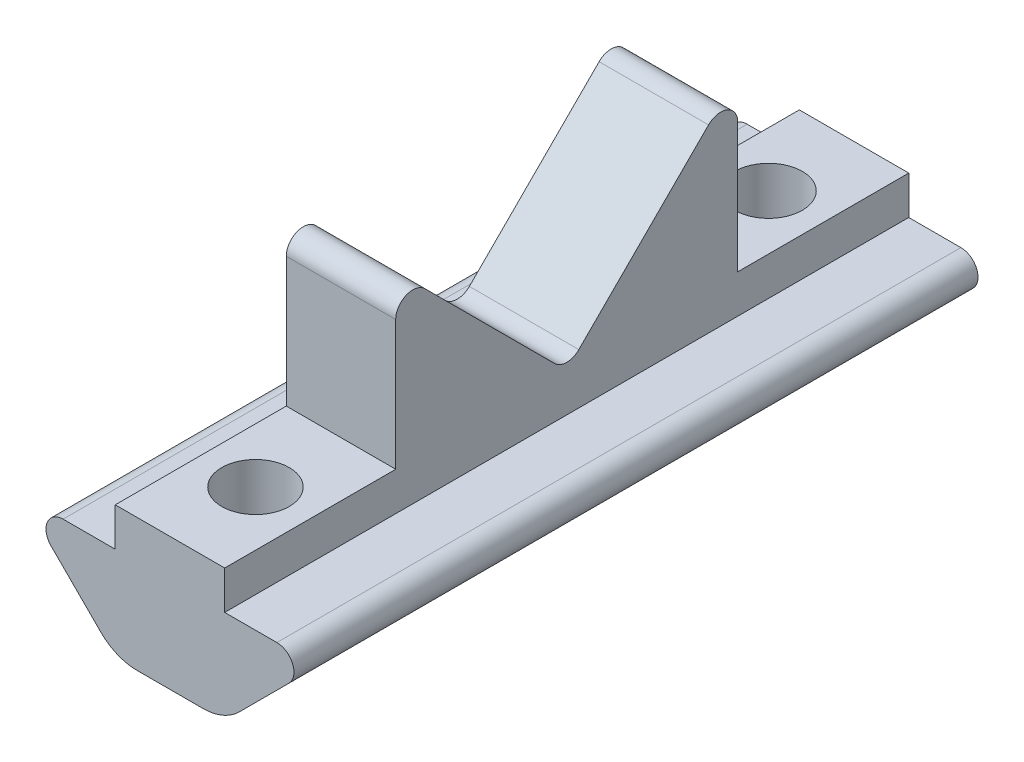
ISO-10303-21;
HEADER;
FILE_DESCRIPTION(('STEP AP214'),'2;1');
FILE_NAME('part.step','',(''),(''),'','','');
FILE_SCHEMA(('AUTOMOTIVE_DESIGN { 1 0 10303 214 1 1 1 1 }'));
ENDSEC;
DATA;
#1=APPLICATION_CONTEXT('core data for automotive mechanical design processes');
#2=APPLICATION_PROTOCOL_DEFINITION('international standard','automotive_design',2000,#1);
#3=PRODUCT_CONTEXT('',#1,'mechanical');
#4=PRODUCT('Part','Part','',(#3));
#5=PRODUCT_RELATED_PRODUCT_CATEGORY('part','',(#4));
#6=PRODUCT_DEFINITION_FORMATION('','',#4);
#7=PRODUCT_DEFINITION_CONTEXT('part definition',#1,'design');
#8=PRODUCT_DEFINITION('design','',#6,#7);
#9=PRODUCT_DEFINITION_SHAPE('','',#8);
#10=(LENGTH_UNIT() NAMED_UNIT(*) SI_UNIT(.MILLI.,.METRE.));
#11=(NAMED_UNIT(*) PLANE_ANGLE_UNIT() SI_UNIT($,.RADIAN.));
#12=(NAMED_UNIT(*) SI_UNIT($,.STERADIAN.) SOLID_ANGLE_UNIT());
#13=UNCERTAINTY_MEASURE_WITH_UNIT(LENGTH_MEASURE(1.E-05),#10,'distance_accuracy_value','');
#14=(GEOMETRIC_REPRESENTATION_CONTEXT(3) GLOBAL_UNCERTAINTY_ASSIGNED_CONTEXT((#13)) GLOBAL_UNIT_ASSIGNED_CONTEXT((#10,
#11,#12)) REPRESENTATION_CONTEXT('',''));
#15=CARTESIAN_POINT('',(0.,0.,0.));
#16=DIRECTION('',(0.,0.,1.));
#17=DIRECTION('',(1.,0.,0.));
#18=AXIS2_PLACEMENT_3D('',#15,#16,#17);
#19=CARTESIAN_POINT('',(3.20000000000003,7.75,20.));
#20=DIRECTION('',(0.,-1.,0.));
#21=DIRECTION('',(0.,0.,-1.));
#22=AXIS2_PLACEMENT_3D('',#19,#20,#21);
#23=PLANE('',#22);
#24=CARTESIAN_POINT('',(0.,7.75,-15.));
#25=DIRECTION('',(0.,1.,0.));
#26=DIRECTION('',(0.,0.,1.));
#27=AXIS2_PLACEMENT_3D('',#24,#25,#26);
#28=CIRCLE('',#27,1.975);
#29=CARTESIAN_POINT('',(0.,7.75,-13.025));
#30=VERTEX_POINT('',#29);
#31=EDGE_CURVE('E334',#30,#30,#28,.T.);
#32=ORIENTED_EDGE('',*,*,#31,.F.);
#33=EDGE_LOOP('',(#32));
#34=FACE_BOUND('',#33,.T.);
#35=DIRECTION('',(-1.,0.,0.));
#36=VECTOR('',#35,1.);
#37=CARTESIAN_POINT('',(17.342135623731,7.75,-9.99999999999999));
#38=LINE('',#37,#36);
#39=CARTESIAN_POINT('',(3.20000000000003,7.75,-9.99999999999999));
#40=VERTEX_POINT('',#39);
#41=CARTESIAN_POINT('',(-3.19999999999997,7.75,-9.99999999999999));
#42=VERTEX_POINT('',#41);
#43=EDGE_CURVE('E205',#40,#42,#38,.T.);
#44=ORIENTED_EDGE('',*,*,#43,.F.);
#45=DIRECTION('',(0.,0.,-1.));
#46=VECTOR('',#45,1.);
#47=CARTESIAN_POINT('',(3.20000000000003,7.75,20.));
#48=LINE('',#47,#46);
#49=CARTESIAN_POINT('',(3.20000000000003,7.75,-20.));
#50=VERTEX_POINT('',#49);
#51=EDGE_CURVE('E214',#40,#50,#48,.T.);
#52=ORIENTED_EDGE('',*,*,#51,.T.);
#53=DIRECTION('',(-1.,0.,0.));
#54=VECTOR('',#53,1.);
#55=CARTESIAN_POINT('',(3.20000000000003,7.75,-20.));
#56=LINE('',#55,#54);
#57=CARTESIAN_POINT('',(-3.19999999999997,7.75,-20.));
#58=VERTEX_POINT('',#57);
#59=EDGE_CURVE('E397',#50,#58,#56,.T.);
#60=ORIENTED_EDGE('',*,*,#59,.T.);
#61=DIRECTION('',(0.,0.,-1.));
#62=VECTOR('',#61,1.);
#63=CARTESIAN_POINT('',(-3.19999999999997,7.75,20.));
#64=LINE('',#63,#62);
#65=EDGE_CURVE('E216',#42,#58,#64,.T.);
#66=ORIENTED_EDGE('',*,*,#65,.F.);
#67=EDGE_LOOP('',(#44,#52,#60,#66));
#68=FACE_BOUND('',#67,.T.);
#69=ADVANCED_FACE('F41',(#34,#68),#23,.F.);
#70=CARTESIAN_POINT('',(-1.92157287525378,0.,20.));
#71=DIRECTION('',(0.,1.,0.));
#72=DIRECTION('',(-1.,0.,0.));
#73=AXIS2_PLACEMENT_3D('',#70,#71,#72);
#74=PLANE('',#73);
#75=DIRECTION('',(0.,0.,-1.));
#76=VECTOR('',#75,1.);
#77=CARTESIAN_POINT('',(-1.92157287525378,0.,20.));
#78=LINE('',#77,#76);
#79=CARTESIAN_POINT('',(-1.92157287525378,0.,14.5437295921398));
#80=VERTEX_POINT('',#79);
#81=CARTESIAN_POINT('',(-1.92157287525378,0.,-14.5437295921398));
#82=VERTEX_POINT('',#81);
#83=EDGE_CURVE('E457',#80,#82,#78,.T.);
#84=ORIENTED_EDGE('',*,*,#83,.T.);
#85=CARTESIAN_POINT('',(0.,0.,-15.));
#86=DIRECTION('',(0.,1.,0.));
#87=DIRECTION('',(0.,0.,1.));
#88=AXIS2_PLACEMENT_3D('',#85,#86,#87);
#89=CIRCLE('',#88,1.975);
#90=CARTESIAN_POINT('',(1.92157287525378,0.,-14.5437295921398));
#91=VERTEX_POINT('',#90);
#92=EDGE_CURVE('E337',#82,#91,#89,.T.);
#93=ORIENTED_EDGE('',*,*,#92,.T.);
#94=DIRECTION('',(0.,0.,-1.));
#95=VECTOR('',#94,1.);
#96=CARTESIAN_POINT('',(1.92157287525376,0.,20.));
#97=LINE('',#96,#95);
#98=CARTESIAN_POINT('',(1.92157287525378,0.,14.5437295921398));
#99=VERTEX_POINT('',#98);
#100=EDGE_CURVE('E451',#99,#91,#97,.T.);
#101=ORIENTED_EDGE('',*,*,#100,.F.);
#102=CARTESIAN_POINT('',(0.,0.,15.));
#103=DIRECTION('',(0.,1.,0.));
#104=DIRECTION('',(0.,0.,-1.));
#105=AXIS2_PLACEMENT_3D('',#102,#103,#104);
#106=CIRCLE('',#105,1.975);
#107=EDGE_CURVE('E345',#99,#80,#106,.T.);
#108=ORIENTED_EDGE('',*,*,#107,.T.);
#109=EDGE_LOOP('',(#84,#93,#101,#108));
#110=FACE_BOUND('',#109,.T.);
#111=ADVANCED_FACE('F326',(#110),#74,.F.);
#112=CARTESIAN_POINT('',(-1.92157287525378,0.,20.));
#113=VERTEX_POINT('',#112);
#114=CARTESIAN_POINT('',(-1.92157287525378,0.,15.4562704078602));
#115=VERTEX_POINT('',#114);
#116=EDGE_CURVE('E452',#113,#115,#78,.T.);
#117=ORIENTED_EDGE('',*,*,#116,.T.);
#118=CARTESIAN_POINT('',(1.92157287525378,0.,15.4562704078602));
#119=VERTEX_POINT('',#118);
#120=EDGE_CURVE('E338',#115,#119,#106,.T.);
#121=ORIENTED_EDGE('',*,*,#120,.T.);
#122=CARTESIAN_POINT('',(1.92157287525376,0.,20.));
#123=VERTEX_POINT('',#122);
#124=EDGE_CURVE('E446',#123,#119,#97,.T.);
#125=ORIENTED_EDGE('',*,*,#124,.F.);
#126=DIRECTION('',(1.,0.,0.));
#127=VECTOR('',#126,1.);
#128=CARTESIAN_POINT('',(-1.92157287525378,0.,20.));
#129=LINE('',#128,#127);
#130=EDGE_CURVE('E379',#113,#123,#129,.T.);
#131=ORIENTED_EDGE('',*,*,#130,.F.);
#132=EDGE_LOOP('',(#117,#121,#125,#131));
#133=FACE_BOUND('',#132,.T.);
#134=ADVANCED_FACE('F314',(#133),#74,.F.);
#135=CARTESIAN_POINT('',(3.20000000000003,5.5,20.));
#136=DIRECTION('',(-1.,0.,0.));
#137=DIRECTION('',(0.,-1.,0.));
#138=AXIS2_PLACEMENT_3D('',#135,#136,#137);
#139=PLANE('',#138);
#140=DIRECTION('',(0.,-1.,0.));
#141=VECTOR('',#140,1.);
#142=CARTESIAN_POINT('',(3.20000000000003,0.,-9.99999999999999));
#143=LINE('',#142,#141);
#144=CARTESIAN_POINT('',(3.20000000000003,15.3357864376269,-9.99999999999999));
#145=VERTEX_POINT('',#144);
#146=EDGE_CURVE('E202',#145,#40,#143,.T.);
#147=ORIENTED_EDGE('',*,*,#146,.F.);
#148=CARTESIAN_POINT('',(3.20000000000003,15.3357864376269,-8.99999999999999));
#149=DIRECTION('',(-1.,0.,0.));
#150=DIRECTION('',(0.,-1.,0.));
#151=AXIS2_PLACEMENT_3D('',#148,#149,#150);
#152=CIRCLE('',#151,1.);
#153=CARTESIAN_POINT('',(3.20000000000003,16.0428932188135,-8.29289321881344));
#154=VERTEX_POINT('',#153);
#155=EDGE_CURVE('E517',#145,#154,#152,.F.);
#156=ORIENTED_EDGE('',*,*,#155,.T.);
#157=DIRECTION('',(0.,0.707106781186548,-0.707106781186547));
#158=VECTOR('',#157,1.);
#159=CARTESIAN_POINT('',(3.20000000000003,3.875,3.875));
#160=LINE('',#159,#158);
#161=CARTESIAN_POINT('',(3.20000000000003,8.45710678118654,-0.707106781186546));
#162=VERTEX_POINT('',#161);
#163=EDGE_CURVE('E210',#162,#154,#160,.T.);
#164=ORIENTED_EDGE('',*,*,#163,.F.);
#165=CARTESIAN_POINT('',(3.20000000000003,9.16421356237309,0.));
#166=DIRECTION('',(-1.,0.,0.));
#167=DIRECTION('',(0.,-1.,0.));
#168=AXIS2_PLACEMENT_3D('',#165,#166,#167);
#169=CIRCLE('',#168,1.);
#170=CARTESIAN_POINT('',(3.20000000000003,8.45710678118654,0.707106781186549));
#171=VERTEX_POINT('',#170);
#172=EDGE_CURVE('E11',#162,#171,#169,.T.);
#173=ORIENTED_EDGE('',*,*,#172,.T.);
#174=DIRECTION('',(0.,0.707106781186548,0.707106781186548));
#175=VECTOR('',#174,1.);
#176=CARTESIAN_POINT('',(3.20000000000003,3.875,-3.875));
#177=LINE('',#176,#175);
#178=CARTESIAN_POINT('',(3.20000000000003,16.0428932188135,8.29289321881345));
#179=VERTEX_POINT('',#178);
#180=EDGE_CURVE('E355',#171,#179,#177,.T.);
#181=ORIENTED_EDGE('',*,*,#180,.T.);
#182=CARTESIAN_POINT('',(3.20000000000003,15.3357864376269,9.));
#183=DIRECTION('',(-1.,0.,0.));
#184=DIRECTION('',(0.,-1.,0.));
#185=AXIS2_PLACEMENT_3D('',#182,#183,#184);
#186=CIRCLE('',#185,1.);
#187=CARTESIAN_POINT('',(3.20000000000003,15.3357864376269,10.));
#188=VERTEX_POINT('',#187);
#189=EDGE_CURVE('E57',#179,#188,#186,.F.);
#190=ORIENTED_EDGE('',*,*,#189,.T.);
#191=DIRECTION('',(0.,-1.,0.));
#192=VECTOR('',#191,1.);
#193=CARTESIAN_POINT('',(3.20000000000003,0.,10.));
#194=LINE('',#193,#192);
#195=CARTESIAN_POINT('',(3.20000000000003,7.75,10.));
#196=VERTEX_POINT('',#195);
#197=EDGE_CURVE('E497',#188,#196,#194,.T.);
#198=ORIENTED_EDGE('',*,*,#197,.T.);
#199=CARTESIAN_POINT('',(3.20000000000003,7.75,20.));
#200=VERTEX_POINT('',#199);
#201=EDGE_CURVE('E226',#200,#196,#48,.T.);
#202=ORIENTED_EDGE('',*,*,#201,.F.);
#203=DIRECTION('',(0.,1.,0.));
#204=VECTOR('',#203,1.);
#205=CARTESIAN_POINT('',(3.20000000000003,5.5,20.));
#206=LINE('',#205,#204);
#207=CARTESIAN_POINT('',(3.20000000000003,5.5,20.));
#208=VERTEX_POINT('',#207);
#209=EDGE_CURVE('E356',#208,#200,#206,.T.);
#210=ORIENTED_EDGE('',*,*,#209,.F.);
#211=DIRECTION('',(0.,0.,-1.));
#212=VECTOR('',#211,1.);
#213=CARTESIAN_POINT('',(3.20000000000003,5.5,20.));
#214=LINE('',#213,#212);
#215=CARTESIAN_POINT('',(3.20000000000003,5.5,-20.));
#216=VERTEX_POINT('',#215);
#217=EDGE_CURVE('E394',#208,#216,#214,.T.);
#218=ORIENTED_EDGE('',*,*,#217,.T.);
#219=DIRECTION('',(0.,1.,0.));
#220=VECTOR('',#219,1.);
#221=CARTESIAN_POINT('',(3.20000000000003,5.5,-20.));
#222=LINE('',#221,#220);
#223=EDGE_CURVE('E224',#216,#50,#222,.T.);
#224=ORIENTED_EDGE('',*,*,#223,.T.);
#225=ORIENTED_EDGE('',*,*,#51,.F.);
#226=EDGE_LOOP('',(#147,#156,#164,#173,#181,#190,#198,#202,#210,#218,#224,#225));
#227=FACE_BOUND('',#226,.T.);
#228=ADVANCED_FACE('F221',(#227),#139,.F.);
#229=CARTESIAN_POINT('',(0.,7.75,15.));
#230=DIRECTION('',(0.,1.,0.));
#231=DIRECTION('',(0.,0.,-1.));
#232=AXIS2_PLACEMENT_3D('',#229,#230,#231);
#233=CIRCLE('',#232,1.975);
#234=CARTESIAN_POINT('',(0.,7.75,13.025));
#235=VERTEX_POINT('',#234);
#236=EDGE_CURVE('E351',#235,#235,#233,.T.);
#237=ORIENTED_EDGE('',*,*,#236,.F.);
#238=EDGE_LOOP('',(#237));
#239=FACE_BOUND('',#238,.T.);
#240=ORIENTED_EDGE('',*,*,#201,.T.);
#241=DIRECTION('',(-1.,0.,0.));
#242=VECTOR('',#241,1.);
#243=CARTESIAN_POINT('',(17.342135623731,7.75,10.));
#244=LINE('',#243,#242);
#245=CARTESIAN_POINT('',(-3.19999999999997,7.75,10.));
#246=VERTEX_POINT('',#245);
#247=EDGE_CURVE('E493',#196,#246,#244,.T.);
#248=ORIENTED_EDGE('',*,*,#247,.T.);
#249=CARTESIAN_POINT('',(-3.19999999999997,7.75,20.));
#250=VERTEX_POINT('',#249);
#251=EDGE_CURVE('E227',#250,#246,#64,.T.);
#252=ORIENTED_EDGE('',*,*,#251,.F.);
#253=DIRECTION('',(-1.,0.,0.));
#254=VECTOR('',#253,1.);
#255=CARTESIAN_POINT('',(3.20000000000003,7.75,20.));
#256=LINE('',#255,#254);
#257=EDGE_CURVE('E360',#200,#250,#256,.T.);
#258=ORIENTED_EDGE('',*,*,#257,.F.);
#259=EDGE_LOOP('',(#240,#248,#252,#258));
#260=FACE_BOUND('',#259,.T.);
#261=ADVANCED_FACE('F307',(#239,#260),#23,.F.);
#262=CARTESIAN_POINT('',(-3.19999999999997,7.75,20.));
#263=DIRECTION('',(1.,0.,0.));
#264=DIRECTION('',(0.,0.,-1.));
#265=AXIS2_PLACEMENT_3D('',#262,#263,#264);
#266=PLANE('',#265);
#267=DIRECTION('',(0.,0.707106781186548,-0.707106781186547));
#268=VECTOR('',#267,1.);
#269=CARTESIAN_POINT('',(-3.19999999999997,3.875,3.875));
#270=LINE('',#269,#268);
#271=CARTESIAN_POINT('',(-3.19999999999997,8.45710678118655,-0.707106781186547));
#272=VERTEX_POINT('',#271);
#273=CARTESIAN_POINT('',(-3.19999999999997,16.0428932188135,-8.29289321881345));
#274=VERTEX_POINT('',#273);
#275=EDGE_CURVE('E530',#272,#274,#270,.T.);
#276=ORIENTED_EDGE('',*,*,#275,.T.);
#277=CARTESIAN_POINT('',(-3.19999999999997,15.3357864376269,-8.99999999999999));
#278=DIRECTION('',(1.,0.,0.));
#279=DIRECTION('',(0.,0.,-1.));
#280=AXIS2_PLACEMENT_3D('',#277,#278,#279);
#281=CIRCLE('',#280,1.);
#282=CARTESIAN_POINT('',(-3.19999999999997,15.3357864376269,-9.99999999999999));
#283=VERTEX_POINT('',#282);
#284=EDGE_CURVE('E522',#274,#283,#281,.F.);
#285=ORIENTED_EDGE('',*,*,#284,.T.);
#286=DIRECTION('',(0.,-1.,0.));
#287=VECTOR('',#286,1.);
#288=CARTESIAN_POINT('',(-3.19999999999997,0.,-9.99999999999999));
#289=LINE('',#288,#287);
#290=EDGE_CURVE('E218',#283,#42,#289,.T.);
#291=ORIENTED_EDGE('',*,*,#290,.T.);
#292=ORIENTED_EDGE('',*,*,#65,.T.);
#293=DIRECTION('',(0.,-1.,0.));
#294=VECTOR('',#293,1.);
#295=CARTESIAN_POINT('',(-3.19999999999997,7.75,-20.));
#296=LINE('',#295,#294);
#297=CARTESIAN_POINT('',(-3.19999999999997,5.5,-20.));
#298=VERTEX_POINT('',#297);
#299=EDGE_CURVE('E400',#58,#298,#296,.T.);
#300=ORIENTED_EDGE('',*,*,#299,.T.);
#301=DIRECTION('',(0.,0.,-1.));
#302=VECTOR('',#301,1.);
#303=CARTESIAN_POINT('',(-3.19999999999997,5.5,20.));
#304=LINE('',#303,#302);
#305=CARTESIAN_POINT('',(-3.19999999999997,5.5,20.));
#306=VERTEX_POINT('',#305);
#307=EDGE_CURVE('E468',#306,#298,#304,.T.);
#308=ORIENTED_EDGE('',*,*,#307,.F.);
#309=DIRECTION('',(0.,-1.,0.));
#310=VECTOR('',#309,1.);
#311=CARTESIAN_POINT('',(-3.19999999999997,7.75,20.));
#312=LINE('',#311,#310);
#313=EDGE_CURVE('E364',#250,#306,#312,.T.);
#314=ORIENTED_EDGE('',*,*,#313,.F.);
#315=ORIENTED_EDGE('',*,*,#251,.T.);
#316=DIRECTION('',(0.,-1.,0.));
#317=VECTOR('',#316,1.);
#318=CARTESIAN_POINT('',(-3.19999999999997,0.,10.));
#319=LINE('',#318,#317);
#320=CARTESIAN_POINT('',(-3.19999999999997,15.3357864376269,10.));
#321=VERTEX_POINT('',#320);
#322=EDGE_CURVE('E489',#321,#246,#319,.T.);
#323=ORIENTED_EDGE('',*,*,#322,.F.);
#324=CARTESIAN_POINT('',(-3.19999999999997,15.3357864376269,9.));
#325=DIRECTION('',(1.,0.,0.));
#326=DIRECTION('',(0.,0.,-1.));
#327=AXIS2_PLACEMENT_3D('',#324,#325,#326);
#328=CIRCLE('',#327,1.);
#329=CARTESIAN_POINT('',(-3.19999999999997,16.0428932188135,8.29289321881346));
#330=VERTEX_POINT('',#329);
#331=EDGE_CURVE('E543',#321,#330,#328,.F.);
#332=ORIENTED_EDGE('',*,*,#331,.T.);
#333=DIRECTION('',(0.,0.707106781186548,0.707106781186548));
#334=VECTOR('',#333,1.);
#335=CARTESIAN_POINT('',(-3.19999999999997,3.875,-3.875));
#336=LINE('',#335,#334);
#337=CARTESIAN_POINT('',(-3.19999999999997,8.45710678118654,0.707106781186549));
#338=VERTEX_POINT('',#337);
#339=EDGE_CURVE('E502',#338,#330,#336,.T.);
#340=ORIENTED_EDGE('',*,*,#339,.F.);
#341=CARTESIAN_POINT('',(-3.19999999999997,9.16421356237309,0.));
#342=DIRECTION('',(1.,0.,0.));
#343=DIRECTION('',(0.,0.,-1.));
#344=AXIS2_PLACEMENT_3D('',#341,#342,#343);
#345=CIRCLE('',#344,1.);
#346=EDGE_CURVE('E50',#338,#272,#345,.T.);
#347=ORIENTED_EDGE('',*,*,#346,.T.);
#348=EDGE_LOOP('',(#276,#285,#291,#292,#300,#308,#314,#315,#323,#332,#340,#347));
#349=FACE_BOUND('',#348,.T.);
#350=ADVANCED_FACE('F303',(#349),#266,.F.);
#351=CARTESIAN_POINT('',(-3.19999999999997,5.5,20.));
#352=DIRECTION('',(0.,-1.,0.));
#353=DIRECTION('',(1.,0.,0.));
#354=AXIS2_PLACEMENT_3D('',#351,#352,#353);
#355=PLANE('',#354);
#356=DIRECTION('',(-1.,0.,0.));
#357=VECTOR('',#356,1.);
#358=CARTESIAN_POINT('',(-3.19999999999997,5.5,-20.));
#359=LINE('',#358,#357);
#360=CARTESIAN_POINT('',(-6.24999999999998,5.49999999999997,-20.));
#361=VERTEX_POINT('',#360);
#362=EDGE_CURVE('E403',#298,#361,#359,.T.);
#363=ORIENTED_EDGE('',*,*,#362,.T.);
#364=DIRECTION('',(0.,0.,-1.));
#365=VECTOR('',#364,1.);
#366=CARTESIAN_POINT('',(-6.24999999999998,5.49999999999997,20.));
#367=LINE('',#366,#365);
#368=CARTESIAN_POINT('',(-6.24999999999998,5.49999999999997,20.));
#369=VERTEX_POINT('',#368);
#370=EDGE_CURVE('E465',#369,#361,#367,.T.);
#371=ORIENTED_EDGE('',*,*,#370,.F.);
#372=DIRECTION('',(-1.,0.,0.));
#373=VECTOR('',#372,1.);
#374=CARTESIAN_POINT('',(-3.19999999999997,5.5,20.));
#375=LINE('',#374,#373);
#376=EDGE_CURVE('E367',#306,#369,#375,.T.);
#377=ORIENTED_EDGE('',*,*,#376,.F.);
#378=ORIENTED_EDGE('',*,*,#307,.T.);
#379=EDGE_LOOP('',(#363,#371,#377,#378));
#380=FACE_BOUND('',#379,.T.);
#381=ADVANCED_FACE('F299',(#380),#355,.F.);
#382=CARTESIAN_POINT('',(-6.25,4.49999999999997,20.));
#383=DIRECTION('',(0.,0.,-1.));
#384=DIRECTION('',(-1.,0.,0.));
#385=AXIS2_PLACEMENT_3D('',#382,#383,#384);
#386=CYLINDRICAL_SURFACE('',#385,1.);
#387=CARTESIAN_POINT('',(-6.25,4.49999999999997,-20.));
#388=DIRECTION('',(0.,0.,1.));
#389=DIRECTION('',(1.,0.,0.));
#390=AXIS2_PLACEMENT_3D('',#387,#388,#389);
#391=CIRCLE('',#390,1.);
#392=CARTESIAN_POINT('',(-6.95710678118653,3.79289321881345,-20.));
#393=VERTEX_POINT('',#392);
#394=EDGE_CURVE('E406',#361,#393,#391,.T.);
#395=ORIENTED_EDGE('',*,*,#394,.T.);
#396=DIRECTION('',(0.,0.,-1.));
#397=VECTOR('',#396,1.);
#398=CARTESIAN_POINT('',(-6.95710678118653,3.79289321881345,20.));
#399=LINE('',#398,#397);
#400=CARTESIAN_POINT('',(-6.95710678118653,3.79289321881345,20.));
#401=VERTEX_POINT('',#400);
#402=EDGE_CURVE('E461',#401,#393,#399,.T.);
#403=ORIENTED_EDGE('',*,*,#402,.F.);
#404=CARTESIAN_POINT('',(-6.25,4.49999999999997,20.));
#405=DIRECTION('',(0.,0.,1.));
#406=DIRECTION('',(1.,0.,0.));
#407=AXIS2_PLACEMENT_3D('',#404,#405,#406);
#408=CIRCLE('',#407,1.);
#409=EDGE_CURVE('E370',#369,#401,#408,.T.);
#410=ORIENTED_EDGE('',*,*,#409,.F.);
#411=ORIENTED_EDGE('',*,*,#370,.T.);
#412=EDGE_LOOP('',(#395,#403,#410,#411));
#413=FACE_BOUND('',#412,.T.);
#414=ADVANCED_FACE('F295',(#413),#386,.T.);
#415=CARTESIAN_POINT('',(-6.95710678118653,3.79289321881345,20.));
#416=DIRECTION('',(0.707106781186544,0.707106781186552,0.));
#417=DIRECTION('',(-0.707106781186551,0.707106781186544,0.));
#418=AXIS2_PLACEMENT_3D('',#415,#416,#417);
#419=PLANE('',#418);
#420=DIRECTION('',(0.707106781186552,-0.707106781186544,0.));
#421=VECTOR('',#420,1.);
#422=CARTESIAN_POINT('',(-6.95710678118653,3.79289321881345,-20.));
#423=LINE('',#422,#421);
#424=CARTESIAN_POINT('',(-4.04289321881341,0.878679656440372,-20.));
#425=VERTEX_POINT('',#424);
#426=EDGE_CURVE('E409',#393,#425,#423,.T.);
#427=ORIENTED_EDGE('',*,*,#426,.T.);
#428=DIRECTION('',(0.,0.,-1.));
#429=VECTOR('',#428,1.);
#430=CARTESIAN_POINT('',(-4.04289321881341,0.878679656440372,20.));
#431=LINE('',#430,#429);
#432=CARTESIAN_POINT('',(-4.04289321881341,0.878679656440372,20.));
#433=VERTEX_POINT('',#432);
#434=EDGE_CURVE('E456',#433,#425,#431,.T.);
#435=ORIENTED_EDGE('',*,*,#434,.F.);
#436=DIRECTION('',(0.707106781186552,-0.707106781186544,0.));
#437=VECTOR('',#436,1.);
#438=CARTESIAN_POINT('',(-6.95710678118653,3.79289321881345,20.));
#439=LINE('',#438,#437);
#440=EDGE_CURVE('E373',#401,#433,#439,.T.);
#441=ORIENTED_EDGE('',*,*,#440,.F.);
#442=ORIENTED_EDGE('',*,*,#402,.T.);
#443=EDGE_LOOP('',(#427,#435,#441,#442));
#444=FACE_BOUND('',#443,.T.);
#445=ADVANCED_FACE('F290',(#444),#419,.F.);
#446=CARTESIAN_POINT('',(-1.92157287525377,3.00000000000002,20.));
#447=DIRECTION('',(0.,0.,-1.));
#448=DIRECTION('',(-1.,0.,0.));
#449=AXIS2_PLACEMENT_3D('',#446,#447,#448);
#450=CYLINDRICAL_SURFACE('',#449,3.);
#451=CARTESIAN_POINT('',(-1.92157287525378,0.,-15.4562704078602));
#452=VERTEX_POINT('',#451);
#453=CARTESIAN_POINT('',(-1.92157287525378,0.,-20.));
#454=VERTEX_POINT('',#453);
#455=EDGE_CURVE('E450',#452,#454,#78,.T.);
#456=ORIENTED_EDGE('',*,*,#455,.F.);
#457=CARTESIAN_POINT('',(-1.92157287525378,0.,-15.4562704078602));
#458=CARTESIAN_POINT('',(-1.93452872316482,1.16913142202988E-05,-15.4017347047765));
#459=CARTESIAN_POINT('',(-1.94515067939166,8.44246906928179E-05,-15.346644917256));
#460=CARTESIAN_POINT('',(-1.96168051568169,0.000253568781306942,-15.2357381249795));
#461=CARTESIAN_POINT('',(-1.96758635715842,0.000349989711100852,-15.179920816329));
#462=CARTESIAN_POINT('',(-1.97455878098999,0.000466789293839193,-15.0690626978395));
#463=CARTESIAN_POINT('',(-1.97571613176243,0.000488592912181313,-15.0140275651342));
#464=CARTESIAN_POINT('',(-1.97343485939798,0.00044790603580732,-14.9040795113799));
#465=CARTESIAN_POINT('',(-1.96999875820222,0.000385461795486157,-14.8491665398365));
#466=CARTESIAN_POINT('',(-1.95988146218098,0.000241341630512759,-14.7524586910133));
#467=CARTESIAN_POINT('',(-1.95413322560446,0.000167440190911543,-14.7105637141658));
#468=CARTESIAN_POINT('',(-1.93990910994308,4.84418178023142E-05,-14.6269150328873));
#469=CARTESIAN_POINT('',(-1.93141304124303,3.56570514846049E-06,-14.5851647608227));
#470=CARTESIAN_POINT('',(-1.92157287525378,0.,-14.5437295921398));
#471=B_SPLINE_CURVE_WITH_KNOTS('',3,(#457,#458,#459,#460,#461,#462,#463,#464,#465,#466,#467,
#468,#469,#470),.UNSPECIFIED.,.F.,.F.,(4,2,2,2,2,2,4),(0.,0.168109960571058,0.336292549031943,
0.501244873300706,0.666106671043821,0.792885808869848,0.920618460627684),.UNSPECIFIED.);
#472=EDGE_CURVE('E278',#452,#82,#471,.T.);
#473=ORIENTED_EDGE('',*,*,#472,.T.);
#474=ORIENTED_EDGE('',*,*,#83,.F.);
#475=CARTESIAN_POINT('',(-1.92157287525378,0.,14.5437295921398));
#476=CARTESIAN_POINT('',(-1.93452872316482,1.16913142202991E-05,14.5982652952235));
#477=CARTESIAN_POINT('',(-1.94515067939166,8.44246906928184E-05,14.653355082744));
#478=CARTESIAN_POINT('',(-1.96168051568169,0.000253568781306943,14.7642618750204));
#479=CARTESIAN_POINT('',(-1.96758635715842,0.000349989711100852,14.820079183671));
#480=CARTESIAN_POINT('',(-1.97455878098999,0.000466789293839192,14.9309373021605));
#481=CARTESIAN_POINT('',(-1.97571613176243,0.000488592912181312,14.9859724348658));
#482=CARTESIAN_POINT('',(-1.97343485939798,0.00044790603580732,15.0959204886201));
#483=CARTESIAN_POINT('',(-1.96999875820222,0.000385461795486157,15.1508334601635));
#484=CARTESIAN_POINT('',(-1.95988146218098,0.000241341630512761,15.2475413089867));
#485=CARTESIAN_POINT('',(-1.95413322560446,0.000167440190911546,15.2894362858342));
#486=CARTESIAN_POINT('',(-1.93990910994308,4.84418178023167E-05,15.3730849671127));
#487=CARTESIAN_POINT('',(-1.93141304124303,3.56570514846161E-06,15.4148352391773));
#488=CARTESIAN_POINT('',(-1.92157287525378,0.,15.4562704078602));
#489=B_SPLINE_CURVE_WITH_KNOTS('',3,(#475,#476,#477,#478,#479,#480,#481,#482,#483,#484,#485,
#486,#487,#488),.UNSPECIFIED.,.F.,.F.,(4,2,2,2,2,2,4),(0.,0.168109960571058,0.336292549031943,
0.501244873300704,0.666106671043821,0.792885808869846,0.920618460627684),.UNSPECIFIED.);
#490=EDGE_CURVE('E269',#80,#115,#489,.T.);
#491=ORIENTED_EDGE('',*,*,#490,.T.);
#492=ORIENTED_EDGE('',*,*,#116,.F.);
#493=CARTESIAN_POINT('',(-1.92157287525377,3.00000000000002,20.));
#494=DIRECTION('',(0.,0.,1.));
#495=DIRECTION('',(-1.,0.,0.));
#496=AXIS2_PLACEMENT_3D('',#493,#494,#495);
#497=CIRCLE('',#496,3.);
#498=EDGE_CURVE('E376',#433,#113,#497,.T.);
#499=ORIENTED_EDGE('',*,*,#498,.F.);
#500=ORIENTED_EDGE('',*,*,#434,.T.);
#501=CARTESIAN_POINT('',(-1.92157287525377,3.00000000000002,-20.));
#502=DIRECTION('',(0.,0.,1.));
#503=DIRECTION('',(-1.,0.,0.));
#504=AXIS2_PLACEMENT_3D('',#501,#502,#503);
#505=CIRCLE('',#504,3.);
#506=EDGE_CURVE('E412',#425,#454,#505,.T.);
#507=ORIENTED_EDGE('',*,*,#506,.T.);
#508=EDGE_LOOP('',(#456,#473,#474,#491,#492,#499,#500,#507));
#509=FACE_BOUND('',#508,.T.);
#510=ADVANCED_FACE('F285',(#509),#450,.T.);
#511=CARTESIAN_POINT('',(1.92157287525378,0.,-15.4562704078602));
#512=VERTEX_POINT('',#511);
#513=CARTESIAN_POINT('',(1.92157287525376,0.,-20.));
#514=VERTEX_POINT('',#513);
#515=EDGE_CURVE('E445',#512,#514,#97,.T.);
#516=ORIENTED_EDGE('',*,*,#515,.F.);
#517=EDGE_CURVE('E279',#512,#452,#89,.T.);
#518=ORIENTED_EDGE('',*,*,#517,.T.);
#519=ORIENTED_EDGE('',*,*,#455,.T.);
#520=DIRECTION('',(1.,0.,0.));
#521=VECTOR('',#520,1.);
#522=CARTESIAN_POINT('',(-1.92157287525378,0.,-20.));
#523=LINE('',#522,#521);
#524=EDGE_CURVE('E416',#454,#514,#523,.T.);
#525=ORIENTED_EDGE('',*,*,#524,.T.);
#526=EDGE_LOOP('',(#516,#518,#519,#525));
#527=FACE_BOUND('',#526,.T.);
#528=ADVANCED_FACE('F289',(#527),#74,.F.);
#529=CARTESIAN_POINT('',(1.9215728752538,2.99999999999999,20.));
#530=DIRECTION('',(0.,0.,-1.));
#531=DIRECTION('',(-1.,0.,0.));
#532=AXIS2_PLACEMENT_3D('',#529,#530,#531);
#533=CYLINDRICAL_SURFACE('',#532,3.);
#534=ORIENTED_EDGE('',*,*,#100,.T.);
#535=CARTESIAN_POINT('',(1.9215728752538,0.,-14.5437295921399));
#536=CARTESIAN_POINT('',(1.93452872316484,1.16913141932073E-05,-14.5982652952236));
#537=CARTESIAN_POINT('',(1.94515067939167,8.44246906655413E-05,-14.653355082744));
#538=CARTESIAN_POINT('',(1.9616805156817,0.000253568781279058,-14.7642618750205));
#539=CARTESIAN_POINT('',(1.96758635715843,0.000349989711072544,-14.8200791836711));
#540=CARTESIAN_POINT('',(1.97455878098999,0.000466789293810835,-14.9309373021606));
#541=CARTESIAN_POINT('',(1.97571613176243,0.000488592912153311,-14.9859724348659));
#542=CARTESIAN_POINT('',(1.97343485939798,0.000447906035779423,-15.0959204886202));
#543=CARTESIAN_POINT('',(1.96999875820221,0.000385461795458009,-15.1508334601635));
#544=CARTESIAN_POINT('',(1.95988146218097,0.000241341630484744,-15.2475413089868));
#545=CARTESIAN_POINT('',(1.95413322560445,0.000167440190883799,-15.2894362858342));
#546=CARTESIAN_POINT('',(1.93990910994308,4.84418177748562E-05,-15.3730849671127));
#547=CARTESIAN_POINT('',(1.93141304124304,3.56570512101657E-06,-15.4148352391772));
#548=CARTESIAN_POINT('',(1.9215728752538,0.,-15.4562704078601));
#549=B_SPLINE_CURVE_WITH_KNOTS('',3,(#535,#536,#537,#538,#539,#540,#541,#542,#543,#544,#545,
#546,#547,#548),.UNSPECIFIED.,.F.,.F.,(4,2,2,2,2,2,4),(0.,0.168109960571058,0.336292549031942,
0.501244873300705,0.666106671043821,0.792885808869779,0.920618460627545),.UNSPECIFIED.);
#550=EDGE_CURVE('E246',#91,#512,#549,.T.);
#551=ORIENTED_EDGE('',*,*,#550,.T.);
#552=ORIENTED_EDGE('',*,*,#515,.T.);
#553=CARTESIAN_POINT('',(1.9215728752538,2.99999999999999,-20.));
#554=DIRECTION('',(0.,0.,1.));
#555=DIRECTION('',(1.,0.,0.));
#556=AXIS2_PLACEMENT_3D('',#553,#554,#555);
#557=CIRCLE('',#556,3.);
#558=CARTESIAN_POINT('',(4.04289321881345,0.878679656440353,-20.));
#559=VERTEX_POINT('',#558);
#560=EDGE_CURVE('E420',#514,#559,#557,.T.);
#561=ORIENTED_EDGE('',*,*,#560,.T.);
#562=DIRECTION('',(0.,0.,-1.));
#563=VECTOR('',#562,1.);
#564=CARTESIAN_POINT('',(4.04289321881345,0.878679656440353,20.));
#565=LINE('',#564,#563);
#566=CARTESIAN_POINT('',(4.04289321881345,0.878679656440353,20.));
#567=VERTEX_POINT('',#566);
#568=EDGE_CURVE('E441',#567,#559,#565,.T.);
#569=ORIENTED_EDGE('',*,*,#568,.F.);
#570=CARTESIAN_POINT('',(1.9215728752538,2.99999999999999,20.));
#571=DIRECTION('',(0.,0.,1.));
#572=DIRECTION('',(1.,0.,0.));
#573=AXIS2_PLACEMENT_3D('',#570,#571,#572);
#574=CIRCLE('',#573,3.);
#575=EDGE_CURVE('E382',#123,#567,#574,.T.);
#576=ORIENTED_EDGE('',*,*,#575,.F.);
#577=ORIENTED_EDGE('',*,*,#124,.T.);
#578=CARTESIAN_POINT('',(1.9215728752538,0.,15.4562704078601));
#579=CARTESIAN_POINT('',(1.93452872316484,1.16913141932073E-05,15.4017347047764));
#580=CARTESIAN_POINT('',(1.94515067939167,8.44246906655413E-05,15.3466449172559));
#581=CARTESIAN_POINT('',(1.9616805156817,0.000253568781279058,15.2357381249795));
#582=CARTESIAN_POINT('',(1.96758635715843,0.000349989711072544,15.1799208163289));
#583=CARTESIAN_POINT('',(1.97455878098999,0.000466789293810835,15.0690626978394));
#584=CARTESIAN_POINT('',(1.97571613176243,0.000488592912153311,15.0140275651341));
#585=CARTESIAN_POINT('',(1.97343485939798,0.000447906035779423,14.9040795113798));
#586=CARTESIAN_POINT('',(1.96999875820221,0.000385461795458009,14.8491665398364));
#587=CARTESIAN_POINT('',(1.95988146218097,0.000241341630484744,14.7524586910132));
#588=CARTESIAN_POINT('',(1.95413322560445,0.000167440190883799,14.7105637141658));
#589=CARTESIAN_POINT('',(1.93990910994308,4.84418177748562E-05,14.6269150328873));
#590=CARTESIAN_POINT('',(1.93141304124304,3.56570512101657E-06,14.5851647608228));
#591=CARTESIAN_POINT('',(1.9215728752538,0.,14.5437295921399));
#592=B_SPLINE_CURVE_WITH_KNOTS('',3,(#578,#579,#580,#581,#582,#583,#584,#585,#586,#587,#588,
#589,#590,#591),.UNSPECIFIED.,.F.,.F.,(4,2,2,2,2,2,4),(0.,0.168109960571058,0.336292549031942,
0.501244873300705,0.666106671043821,0.792885808869779,0.920618460627545),.UNSPECIFIED.);
#593=EDGE_CURVE('E232',#119,#99,#592,.T.);
#594=ORIENTED_EDGE('',*,*,#593,.T.);
#595=EDGE_LOOP('',(#534,#551,#552,#561,#569,#576,#577,#594));
#596=FACE_BOUND('',#595,.T.);
#597=ADVANCED_FACE('F253',(#596),#533,.T.);
#598=CARTESIAN_POINT('',(4.04289321881345,0.878679656440353,20.));
#599=DIRECTION('',(-0.707106781186546,0.707106781186549,0.));
#600=DIRECTION('',(-0.707106781186549,-0.707106781186546,0.));
#601=AXIS2_PLACEMENT_3D('',#598,#599,#600);
#602=PLANE('',#601);
#603=DIRECTION('',(0.707106781186549,0.707106781186546,0.));
#604=VECTOR('',#603,1.);
#605=CARTESIAN_POINT('',(4.04289321881345,0.878679656440353,-20.));
#606=LINE('',#605,#604);
#607=CARTESIAN_POINT('',(6.95710678118657,3.79289321881345,-20.));
#608=VERTEX_POINT('',#607);
#609=EDGE_CURVE('E423',#559,#608,#606,.T.);
#610=ORIENTED_EDGE('',*,*,#609,.T.);
#611=DIRECTION('',(0.,0.,-1.));
#612=VECTOR('',#611,1.);
#613=CARTESIAN_POINT('',(6.95710678118657,3.79289321881345,20.));
#614=LINE('',#613,#612);
#615=CARTESIAN_POINT('',(6.95710678118657,3.79289321881345,20.));
#616=VERTEX_POINT('',#615);
#617=EDGE_CURVE('E437',#616,#608,#614,.T.);
#618=ORIENTED_EDGE('',*,*,#617,.F.);
#619=DIRECTION('',(0.707106781186549,0.707106781186546,0.));
#620=VECTOR('',#619,1.);
#621=CARTESIAN_POINT('',(4.04289321881345,0.878679656440353,20.));
#622=LINE('',#621,#620);
#623=EDGE_CURVE('E385',#567,#616,#622,.T.);
#624=ORIENTED_EDGE('',*,*,#623,.F.);
#625=ORIENTED_EDGE('',*,*,#568,.T.);
#626=EDGE_LOOP('',(#610,#618,#624,#625));
#627=FACE_BOUND('',#626,.T.);
#628=ADVANCED_FACE('F679',(#627),#602,.F.);
#629=CARTESIAN_POINT('',(6.25,4.49999999999997,20.));
#630=DIRECTION('',(0.,0.,-1.));
#631=DIRECTION('',(-1.,0.,0.));
#632=AXIS2_PLACEMENT_3D('',#629,#630,#631);
#633=CYLINDRICAL_SURFACE('',#632,0.99999999999999);
#634=CARTESIAN_POINT('',(6.25,4.49999999999997,-20.));
#635=DIRECTION('',(0.,0.,1.));
#636=DIRECTION('',(1.,0.,0.));
#637=AXIS2_PLACEMENT_3D('',#634,#635,#636);
#638=CIRCLE('',#637,0.99999999999999);
#639=CARTESIAN_POINT('',(6.25,5.49999999999996,-20.));
#640=VERTEX_POINT('',#639);
#641=EDGE_CURVE('E426',#608,#640,#638,.T.);
#642=ORIENTED_EDGE('',*,*,#641,.T.);
#643=DIRECTION('',(0.,0.,-1.));
#644=VECTOR('',#643,1.);
#645=CARTESIAN_POINT('',(6.25,5.49999999999996,20.));
#646=LINE('',#645,#644);
#647=CARTESIAN_POINT('',(6.25,5.49999999999996,20.));
#648=VERTEX_POINT('',#647);
#649=EDGE_CURVE('E433',#648,#640,#646,.T.);
#650=ORIENTED_EDGE('',*,*,#649,.F.);
#651=CARTESIAN_POINT('',(6.25,4.49999999999997,20.));
#652=DIRECTION('',(0.,0.,1.));
#653=DIRECTION('',(1.,0.,0.));
#654=AXIS2_PLACEMENT_3D('',#651,#652,#653);
#655=CIRCLE('',#654,0.99999999999999);
#656=EDGE_CURVE('E388',#616,#648,#655,.T.);
#657=ORIENTED_EDGE('',*,*,#656,.F.);
#658=ORIENTED_EDGE('',*,*,#617,.T.);
#659=EDGE_LOOP('',(#642,#650,#657,#658));
#660=FACE_BOUND('',#659,.T.);
#661=ADVANCED_FACE('F729',(#660),#633,.T.);
#662=CARTESIAN_POINT('',(6.25,5.49999999999996,20.));
#663=DIRECTION('',(0.,-1.,0.));
#664=DIRECTION('',(1.,0.,0.));
#665=AXIS2_PLACEMENT_3D('',#662,#663,#664);
#666=PLANE('',#665);
#667=DIRECTION('',(-1.,0.,0.));
#668=VECTOR('',#667,1.);
#669=CARTESIAN_POINT('',(6.25,5.49999999999996,-20.));
#670=LINE('',#669,#668);
#671=EDGE_CURVE('E361',#640,#216,#670,.T.);
#672=ORIENTED_EDGE('',*,*,#671,.T.);
#673=ORIENTED_EDGE('',*,*,#217,.F.);
#674=DIRECTION('',(-1.,0.,0.));
#675=VECTOR('',#674,1.);
#676=CARTESIAN_POINT('',(6.25,5.49999999999996,20.));
#677=LINE('',#676,#675);
#678=EDGE_CURVE('E391',#648,#208,#677,.T.);
#679=ORIENTED_EDGE('',*,*,#678,.F.);
#680=ORIENTED_EDGE('',*,*,#649,.T.);
#681=EDGE_LOOP('',(#672,#673,#679,#680));
#682=FACE_BOUND('',#681,.T.);
#683=ADVANCED_FACE('F721',(#682),#666,.F.);
#684=CARTESIAN_POINT('',(-6.25,4.49999999999997,20.));
#685=DIRECTION('',(0.,0.,1.));
#686=DIRECTION('',(1.,0.,0.));
#687=AXIS2_PLACEMENT_3D('',#684,#685,#686);
#688=PLANE('',#687);
#689=ORIENTED_EDGE('',*,*,#209,.T.);
#690=ORIENTED_EDGE('',*,*,#257,.T.);
#691=ORIENTED_EDGE('',*,*,#313,.T.);
#692=ORIENTED_EDGE('',*,*,#376,.T.);
#693=ORIENTED_EDGE('',*,*,#409,.T.);
#694=ORIENTED_EDGE('',*,*,#440,.T.);
#695=ORIENTED_EDGE('',*,*,#498,.T.);
#696=ORIENTED_EDGE('',*,*,#130,.T.);
#697=ORIENTED_EDGE('',*,*,#575,.T.);
#698=ORIENTED_EDGE('',*,*,#623,.T.);
#699=ORIENTED_EDGE('',*,*,#656,.T.);
#700=ORIENTED_EDGE('',*,*,#678,.T.);
#701=EDGE_LOOP('',(#689,#690,#691,#692,#693,#694,#695,#696,#697,#698,#699,#700));
#702=FACE_BOUND('',#701,.T.);
#703=ADVANCED_FACE('F266',(#702),#688,.T.);
#704=CARTESIAN_POINT('',(-6.25,4.49999999999997,-20.));
#705=DIRECTION('',(0.,0.,1.));
#706=DIRECTION('',(1.,0.,0.));
#707=AXIS2_PLACEMENT_3D('',#704,#705,#706);
#708=PLANE('',#707);
#709=ORIENTED_EDGE('',*,*,#223,.F.);
#710=ORIENTED_EDGE('',*,*,#671,.F.);
#711=ORIENTED_EDGE('',*,*,#641,.F.);
#712=ORIENTED_EDGE('',*,*,#609,.F.);
#713=ORIENTED_EDGE('',*,*,#560,.F.);
#714=ORIENTED_EDGE('',*,*,#524,.F.);
#715=ORIENTED_EDGE('',*,*,#506,.F.);
#716=ORIENTED_EDGE('',*,*,#426,.F.);
#717=ORIENTED_EDGE('',*,*,#394,.F.);
#718=ORIENTED_EDGE('',*,*,#362,.F.);
#719=ORIENTED_EDGE('',*,*,#299,.F.);
#720=ORIENTED_EDGE('',*,*,#59,.F.);
#721=EDGE_LOOP('',(#709,#710,#711,#712,#713,#714,#715,#716,#717,#718,#719,#720));
#722=FACE_BOUND('',#721,.T.);
#723=ADVANCED_FACE('F262',(#722),#708,.F.);
#724=CARTESIAN_POINT('',(0.,0.,15.));
#725=DIRECTION('',(0.,1.,0.));
#726=DIRECTION('',(0.,0.,1.));
#727=AXIS2_PLACEMENT_3D('',#724,#725,#726);
#728=CYLINDRICAL_SURFACE('',#727,1.975);
#729=ORIENTED_EDGE('',*,*,#236,.T.);
#730=EDGE_LOOP('',(#729));
#731=FACE_BOUND('',#730,.T.);
#732=ORIENTED_EDGE('',*,*,#107,.F.);
#733=ORIENTED_EDGE('',*,*,#593,.F.);
#734=ORIENTED_EDGE('',*,*,#120,.F.);
#735=ORIENTED_EDGE('',*,*,#490,.F.);
#736=EDGE_LOOP('',(#732,#733,#734,#735));
#737=FACE_BOUND('',#736,.T.);
#738=ADVANCED_FACE('F257',(#731,#737),#728,.F.);
#739=CARTESIAN_POINT('',(0.,0.,-15.));
#740=DIRECTION('',(0.,1.,0.));
#741=DIRECTION('',(0.,0.,1.));
#742=AXIS2_PLACEMENT_3D('',#739,#740,#741);
#743=CYLINDRICAL_SURFACE('',#742,1.975);
#744=ORIENTED_EDGE('',*,*,#31,.T.);
#745=EDGE_LOOP('',(#744));
#746=FACE_BOUND('',#745,.T.);
#747=ORIENTED_EDGE('',*,*,#517,.F.);
#748=ORIENTED_EDGE('',*,*,#550,.F.);
#749=ORIENTED_EDGE('',*,*,#92,.F.);
#750=ORIENTED_EDGE('',*,*,#472,.F.);
#751=EDGE_LOOP('',(#747,#748,#749,#750));
#752=FACE_BOUND('',#751,.T.);
#753=ADVANCED_FACE('F261',(#746,#752),#743,.F.);
#754=CARTESIAN_POINT('',(17.342135623731,0.,10.));
#755=DIRECTION('',(0.,0.,1.));
#756=DIRECTION('',(1.,0.,0.));
#757=AXIS2_PLACEMENT_3D('',#754,#755,#756);
#758=PLANE('',#757);
#759=ORIENTED_EDGE('',*,*,#197,.F.);
#760=DIRECTION('',(-1.,0.,0.));
#761=VECTOR('',#760,1.);
#762=CARTESIAN_POINT('',(17.342135623731,15.3357864376269,10.));
#763=LINE('',#762,#761);
#764=EDGE_CURVE('E515',#188,#321,#763,.T.);
#765=ORIENTED_EDGE('',*,*,#764,.T.);
#766=ORIENTED_EDGE('',*,*,#322,.T.);
#767=ORIENTED_EDGE('',*,*,#247,.F.);
#768=EDGE_LOOP('',(#759,#765,#766,#767));
#769=FACE_BOUND('',#768,.T.);
#770=ADVANCED_FACE('F584',(#769),#758,.T.);
#771=CARTESIAN_POINT('',(17.342135623731,3.875,-3.875));
#772=DIRECTION('',(0.,0.707106781186548,-0.707106781186548));
#773=DIRECTION('',(0.,0.707106781186548,0.707106781186548));
#774=AXIS2_PLACEMENT_3D('',#771,#772,#773);
#775=PLANE('',#774);
#776=ORIENTED_EDGE('',*,*,#180,.F.);
#777=DIRECTION('',(-1.,0.,0.));
#778=VECTOR('',#777,1.);
#779=CARTESIAN_POINT('',(17.342135623731,8.45710678118654,0.707106781186548));
#780=LINE('',#779,#778);
#781=EDGE_CURVE('E548',#171,#338,#780,.T.);
#782=ORIENTED_EDGE('',*,*,#781,.T.);
#783=ORIENTED_EDGE('',*,*,#339,.T.);
#784=DIRECTION('',(-1.,0.,0.));
#785=VECTOR('',#784,1.);
#786=CARTESIAN_POINT('',(17.342135623731,16.0428932188135,8.29289321881345));
#787=LINE('',#786,#785);
#788=EDGE_CURVE('E513',#330,#179,#787,.F.);
#789=ORIENTED_EDGE('',*,*,#788,.T.);
#790=EDGE_LOOP('',(#776,#782,#783,#789));
#791=FACE_BOUND('',#790,.T.);
#792=ADVANCED_FACE('F558',(#791),#775,.T.);
#793=CARTESIAN_POINT('',(17.342135623731,3.875,3.875));
#794=DIRECTION('',(0.,-0.707106781186547,-0.707106781186548));
#795=DIRECTION('',(0.,0.707106781186548,-0.707106781186547));
#796=AXIS2_PLACEMENT_3D('',#793,#794,#795);
#797=PLANE('',#796);
#798=ORIENTED_EDGE('',*,*,#275,.F.);
#799=DIRECTION('',(-1.,0.,0.));
#800=VECTOR('',#799,1.);
#801=CARTESIAN_POINT('',(17.342135623731,8.45710678118655,-0.707106781186546));
#802=LINE('',#801,#800);
#803=EDGE_CURVE('E537',#272,#162,#802,.F.);
#804=ORIENTED_EDGE('',*,*,#803,.T.);
#805=ORIENTED_EDGE('',*,*,#163,.T.);
#806=DIRECTION('',(-1.,0.,0.));
#807=VECTOR('',#806,1.);
#808=CARTESIAN_POINT('',(17.342135623731,16.0428932188135,-8.29289321881344));
#809=LINE('',#808,#807);
#810=EDGE_CURVE('E539',#154,#274,#809,.T.);
#811=ORIENTED_EDGE('',*,*,#810,.T.);
#812=EDGE_LOOP('',(#798,#804,#805,#811));
#813=FACE_BOUND('',#812,.T.);
#814=ADVANCED_FACE('F535',(#813),#797,.F.);
#815=CARTESIAN_POINT('',(17.342135623731,0.,-9.99999999999999));
#816=DIRECTION('',(0.,0.,1.));
#817=DIRECTION('',(1.,0.,0.));
#818=AXIS2_PLACEMENT_3D('',#815,#816,#817);
#819=PLANE('',#818);
#820=ORIENTED_EDGE('',*,*,#290,.F.);
#821=DIRECTION('',(-1.,0.,0.));
#822=VECTOR('',#821,1.);
#823=CARTESIAN_POINT('',(17.342135623731,15.3357864376269,-9.99999999999999));
#824=LINE('',#823,#822);
#825=EDGE_CURVE('E65',#283,#145,#824,.F.);
#826=ORIENTED_EDGE('',*,*,#825,.T.);
#827=ORIENTED_EDGE('',*,*,#146,.T.);
#828=ORIENTED_EDGE('',*,*,#43,.T.);
#829=EDGE_LOOP('',(#820,#826,#827,#828));
#830=FACE_BOUND('',#829,.T.);
#831=ADVANCED_FACE('F204',(#830),#819,.F.);
#832=CARTESIAN_POINT('',(17.342135623731,9.16421356237309,0.));
#833=DIRECTION('',(-1.,0.,0.));
#834=DIRECTION('',(0.,0.,1.));
#835=AXIS2_PLACEMENT_3D('',#832,#833,#834);
#836=CYLINDRICAL_SURFACE('',#835,1.);
#837=ORIENTED_EDGE('',*,*,#172,.F.);
#838=ORIENTED_EDGE('',*,*,#803,.F.);
#839=ORIENTED_EDGE('',*,*,#346,.F.);
#840=ORIENTED_EDGE('',*,*,#781,.F.);
#841=EDGE_LOOP('',(#837,#838,#839,#840));
#842=FACE_BOUND('',#841,.T.);
#843=ADVANCED_FACE('F315',(#842),#836,.F.);
#844=CARTESIAN_POINT('',(17.342135623731,15.3357864376269,-8.99999999999999));
#845=DIRECTION('',(-1.,0.,0.));
#846=DIRECTION('',(0.,0.,1.));
#847=AXIS2_PLACEMENT_3D('',#844,#845,#846);
#848=CYLINDRICAL_SURFACE('',#847,1.);
#849=ORIENTED_EDGE('',*,*,#155,.F.);
#850=ORIENTED_EDGE('',*,*,#825,.F.);
#851=ORIENTED_EDGE('',*,*,#284,.F.);
#852=ORIENTED_EDGE('',*,*,#810,.F.);
#853=EDGE_LOOP('',(#849,#850,#851,#852));
#854=FACE_BOUND('',#853,.T.);
#855=ADVANCED_FACE('F317',(#854),#848,.T.);
#856=CARTESIAN_POINT('',(17.342135623731,15.3357864376269,9.));
#857=DIRECTION('',(-1.,0.,0.));
#858=DIRECTION('',(0.,0.,1.));
#859=AXIS2_PLACEMENT_3D('',#856,#857,#858);
#860=CYLINDRICAL_SURFACE('',#859,1.);
#861=ORIENTED_EDGE('',*,*,#189,.F.);
#862=ORIENTED_EDGE('',*,*,#788,.F.);
#863=ORIENTED_EDGE('',*,*,#331,.F.);
#864=ORIENTED_EDGE('',*,*,#764,.F.);
#865=EDGE_LOOP('',(#861,#862,#863,#864));
#866=FACE_BOUND('',#865,.T.);
#867=ADVANCED_FACE('F43',(#866),#860,.T.);
#868=CLOSED_SHELL('',(#69,#111,#134,#228,#261,#350,#381,#414,#445,#510,#528,#597,#628,#661,#683,
#703,#723,#738,#753,#770,#792,#814,#831,#843,#855,#867));
#869=MANIFOLD_SOLID_BREP('B2',#868);
#870=ADVANCED_BREP_SHAPE_REPRESENTATION('',(#18,#869),#14);
#871=SHAPE_DEFINITION_REPRESENTATION(#9,#870);
ENDSEC;
END-ISO-10303-21;
